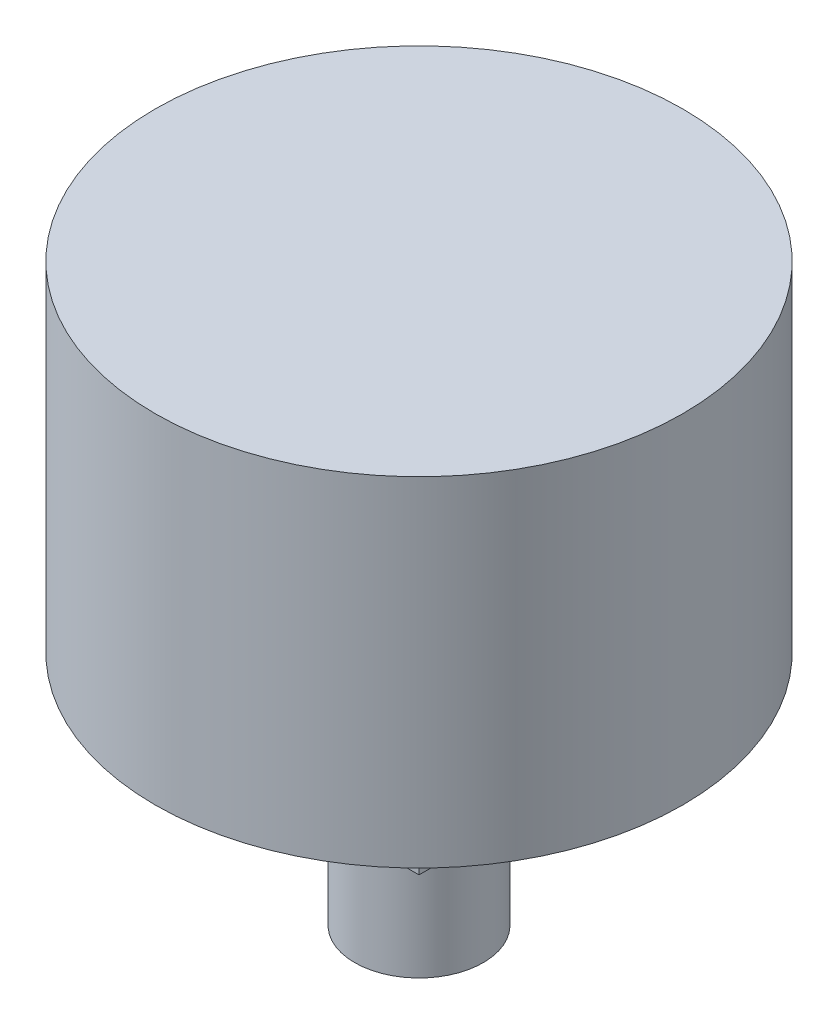
ISO-10303-21;
HEADER;
FILE_DESCRIPTION(('STEP AP214'),'2;1');
FILE_NAME('part.step','',(''),(''),'','','');
FILE_SCHEMA(('AUTOMOTIVE_DESIGN { 1 0 10303 214 1 1 1 1 }'));
ENDSEC;
DATA;
#1=APPLICATION_CONTEXT('core data for automotive mechanical design processes');
#2=APPLICATION_PROTOCOL_DEFINITION('international standard','automotive_design',2000,#1);
#3=PRODUCT_CONTEXT('',#1,'mechanical');
#4=PRODUCT('Part','Part','',(#3));
#5=PRODUCT_RELATED_PRODUCT_CATEGORY('part','',(#4));
#6=PRODUCT_DEFINITION_FORMATION('','',#4);
#7=PRODUCT_DEFINITION_CONTEXT('part definition',#1,'design');
#8=PRODUCT_DEFINITION('design','',#6,#7);
#9=PRODUCT_DEFINITION_SHAPE('','',#8);
#10=(LENGTH_UNIT() NAMED_UNIT(*) SI_UNIT(.MILLI.,.METRE.));
#11=(NAMED_UNIT(*) PLANE_ANGLE_UNIT() SI_UNIT($,.RADIAN.));
#12=(NAMED_UNIT(*) SI_UNIT($,.STERADIAN.) SOLID_ANGLE_UNIT());
#13=UNCERTAINTY_MEASURE_WITH_UNIT(LENGTH_MEASURE(1.E-05),#10,'distance_accuracy_value','');
#14=(GEOMETRIC_REPRESENTATION_CONTEXT(3) GLOBAL_UNCERTAINTY_ASSIGNED_CONTEXT((#13)) GLOBAL_UNIT_ASSIGNED_CONTEXT((#10,
#11,#12)) REPRESENTATION_CONTEXT('',''));
#15=CARTESIAN_POINT('',(0.,0.,0.));
#16=DIRECTION('',(0.,0.,1.));
#17=DIRECTION('',(1.,0.,0.));
#18=AXIS2_PLACEMENT_3D('',#15,#16,#17);
#19=CARTESIAN_POINT('',(7.0231,-7.7978,7.0231));
#20=DIRECTION('',(0.,1.,0.));
#21=DIRECTION('',(0.,0.,1.));
#22=AXIS2_PLACEMENT_3D('',#19,#20,#21);
#23=PLANE('',#22);
#24=DIRECTION('',(0.,0.,1.));
#25=VECTOR('',#24,1.);
#26=CARTESIAN_POINT('',(7.0231,-7.7978,-7.0231));
#27=LINE('',#26,#25);
#28=CARTESIAN_POINT('',(7.0231,-7.7978,-7.0231));
#29=VERTEX_POINT('',#28);
#30=CARTESIAN_POINT('',(7.0231,-7.7978,7.0231));
#31=VERTEX_POINT('',#30);
#32=EDGE_CURVE('E83',#29,#31,#27,.T.);
#33=ORIENTED_EDGE('',*,*,#32,.T.);
#34=DIRECTION('',(-1.,0.,0.));
#35=VECTOR('',#34,1.);
#36=CARTESIAN_POINT('',(-7.0231,-7.7978,7.0231));
#37=LINE('',#36,#35);
#38=CARTESIAN_POINT('',(-7.0231,-7.7978,7.0231));
#39=VERTEX_POINT('',#38);
#40=EDGE_CURVE('E72',#31,#39,#37,.T.);
#41=ORIENTED_EDGE('',*,*,#40,.T.);
#42=DIRECTION('',(0.,0.,-1.));
#43=VECTOR('',#42,1.);
#44=CARTESIAN_POINT('',(-7.0231,-7.7978,-7.0231));
#45=LINE('',#44,#43);
#46=CARTESIAN_POINT('',(-7.0231,-7.7978,-7.0231));
#47=VERTEX_POINT('',#46);
#48=EDGE_CURVE('E82',#39,#47,#45,.T.);
#49=ORIENTED_EDGE('',*,*,#48,.T.);
#50=DIRECTION('',(1.,0.,0.));
#51=VECTOR('',#50,1.);
#52=CARTESIAN_POINT('',(-7.0231,-7.7978,-7.0231));
#53=LINE('',#52,#51);
#54=EDGE_CURVE('E88',#47,#29,#53,.T.);
#55=ORIENTED_EDGE('',*,*,#54,.T.);
#56=EDGE_LOOP('',(#33,#41,#49,#55));
#57=FACE_BOUND('',#56,.T.);
#58=CARTESIAN_POINT('',(0.,-7.7978,0.));
#59=DIRECTION('',(0.,1.,0.));
#60=DIRECTION('',(0.,0.,1.));
#61=AXIS2_PLACEMENT_3D('',#58,#59,#60);
#62=CIRCLE('',#61,4.953);
#63=CARTESIAN_POINT('',(0.,-7.7978,4.953));
#64=VERTEX_POINT('',#63);
#65=EDGE_CURVE('E12',#64,#64,#62,.F.);
#66=ORIENTED_EDGE('',*,*,#65,.F.);
#67=EDGE_LOOP('',(#66));
#68=FACE_BOUND('',#67,.T.);
#69=ADVANCED_FACE('F34',(#57,#68),#23,.F.);
#70=CARTESIAN_POINT('',(0.,0.,0.));
#71=DIRECTION('',(0.,1.,0.));
#72=DIRECTION('',(0.,0.,1.));
#73=AXIS2_PLACEMENT_3D('',#70,#71,#72);
#74=PLANE('',#73);
#75=CARTESIAN_POINT('',(0.,0.,0.));
#76=DIRECTION('',(0.,1.,0.));
#77=DIRECTION('',(0.,0.,1.));
#78=AXIS2_PLACEMENT_3D('',#75,#76,#77);
#79=CIRCLE('',#78,20.32);
#80=CARTESIAN_POINT('',(0.,0.,20.32));
#81=VERTEX_POINT('',#80);
#82=EDGE_CURVE('E96',#81,#81,#79,.T.);
#83=ORIENTED_EDGE('',*,*,#82,.F.);
#84=EDGE_LOOP('',(#83));
#85=FACE_BOUND('',#84,.T.);
#86=DIRECTION('',(0.,0.,1.));
#87=VECTOR('',#86,1.);
#88=CARTESIAN_POINT('',(7.0231,0.,-7.0231));
#89=LINE('',#88,#87);
#90=CARTESIAN_POINT('',(7.0231,0.,-7.0231));
#91=VERTEX_POINT('',#90);
#92=CARTESIAN_POINT('',(7.0231,0.,7.0231));
#93=VERTEX_POINT('',#92);
#94=EDGE_CURVE('E95',#91,#93,#89,.T.);
#95=ORIENTED_EDGE('',*,*,#94,.F.);
#96=DIRECTION('',(1.,0.,0.));
#97=VECTOR('',#96,1.);
#98=CARTESIAN_POINT('',(-7.0231,0.,-7.0231));
#99=LINE('',#98,#97);
#100=CARTESIAN_POINT('',(-7.0231,0.,-7.0231));
#101=VERTEX_POINT('',#100);
#102=EDGE_CURVE('E92',#101,#91,#99,.T.);
#103=ORIENTED_EDGE('',*,*,#102,.F.);
#104=DIRECTION('',(0.,0.,-1.));
#105=VECTOR('',#104,1.);
#106=CARTESIAN_POINT('',(-7.0231,0.,-7.0231));
#107=LINE('',#106,#105);
#108=CARTESIAN_POINT('',(-7.0231,0.,7.0231));
#109=VERTEX_POINT('',#108);
#110=EDGE_CURVE('E54',#109,#101,#107,.T.);
#111=ORIENTED_EDGE('',*,*,#110,.F.);
#112=DIRECTION('',(-1.,0.,0.));
#113=VECTOR('',#112,1.);
#114=CARTESIAN_POINT('',(-7.0231,0.,7.0231));
#115=LINE('',#114,#113);
#116=EDGE_CURVE('E49',#93,#109,#115,.T.);
#117=ORIENTED_EDGE('',*,*,#116,.F.);
#118=EDGE_LOOP('',(#95,#103,#111,#117));
#119=FACE_BOUND('',#118,.T.);
#120=ADVANCED_FACE('F110',(#85,#119),#74,.F.);
#121=CARTESIAN_POINT('',(0.,26.0985,0.));
#122=DIRECTION('',(0.,-1.,0.));
#123=DIRECTION('',(0.,0.,-1.));
#124=AXIS2_PLACEMENT_3D('',#121,#122,#123);
#125=CYLINDRICAL_SURFACE('',#124,20.32);
#126=CARTESIAN_POINT('',(0.,26.0985,0.));
#127=DIRECTION('',(0.,1.,0.));
#128=DIRECTION('',(0.,0.,1.));
#129=AXIS2_PLACEMENT_3D('',#126,#127,#128);
#130=CIRCLE('',#129,20.32);
#131=CARTESIAN_POINT('',(0.,26.0985,20.32));
#132=VERTEX_POINT('',#131);
#133=EDGE_CURVE('E42',#132,#132,#130,.T.);
#134=ORIENTED_EDGE('',*,*,#133,.F.);
#135=EDGE_LOOP('',(#134));
#136=FACE_BOUND('',#135,.T.);
#137=ORIENTED_EDGE('',*,*,#82,.T.);
#138=EDGE_LOOP('',(#137));
#139=FACE_BOUND('',#138,.T.);
#140=ADVANCED_FACE('F36',(#136,#139),#125,.T.);
#141=CARTESIAN_POINT('',(0.,26.0985,0.));
#142=DIRECTION('',(0.,1.,0.));
#143=DIRECTION('',(0.,0.,1.));
#144=AXIS2_PLACEMENT_3D('',#141,#142,#143);
#145=PLANE('',#144);
#146=ORIENTED_EDGE('',*,*,#133,.T.);
#147=EDGE_LOOP('',(#146));
#148=FACE_BOUND('',#147,.T.);
#149=ADVANCED_FACE('F106',(#148),#145,.T.);
#150=CARTESIAN_POINT('',(7.0231,-7.7978,-7.0231));
#151=DIRECTION('',(-1.,0.,0.));
#152=DIRECTION('',(0.,0.,1.));
#153=AXIS2_PLACEMENT_3D('',#150,#151,#152);
#154=PLANE('',#153);
#155=ORIENTED_EDGE('',*,*,#94,.T.);
#156=DIRECTION('',(0.,1.,0.));
#157=VECTOR('',#156,1.);
#158=CARTESIAN_POINT('',(7.0231,-7.7978,7.0231));
#159=LINE('',#158,#157);
#160=EDGE_CURVE('E76',#31,#93,#159,.T.);
#161=ORIENTED_EDGE('',*,*,#160,.F.);
#162=ORIENTED_EDGE('',*,*,#32,.F.);
#163=DIRECTION('',(0.,1.,0.));
#164=VECTOR('',#163,1.);
#165=CARTESIAN_POINT('',(7.0231,-7.7978,-7.0231));
#166=LINE('',#165,#164);
#167=EDGE_CURVE('E120',#29,#91,#166,.T.);
#168=ORIENTED_EDGE('',*,*,#167,.T.);
#169=EDGE_LOOP('',(#155,#161,#162,#168));
#170=FACE_BOUND('',#169,.T.);
#171=ADVANCED_FACE('F94',(#170),#154,.F.);
#172=CARTESIAN_POINT('',(-7.0231,-7.7978,7.0231));
#173=DIRECTION('',(0.,0.,-1.));
#174=DIRECTION('',(-1.,0.,0.));
#175=AXIS2_PLACEMENT_3D('',#172,#173,#174);
#176=PLANE('',#175);
#177=ORIENTED_EDGE('',*,*,#116,.T.);
#178=DIRECTION('',(0.,1.,0.));
#179=VECTOR('',#178,1.);
#180=CARTESIAN_POINT('',(-7.0231,-7.7978,7.0231));
#181=LINE('',#180,#179);
#182=EDGE_CURVE('E79',#39,#109,#181,.T.);
#183=ORIENTED_EDGE('',*,*,#182,.F.);
#184=ORIENTED_EDGE('',*,*,#40,.F.);
#185=ORIENTED_EDGE('',*,*,#160,.T.);
#186=EDGE_LOOP('',(#177,#183,#184,#185));
#187=FACE_BOUND('',#186,.T.);
#188=ADVANCED_FACE('F74',(#187),#176,.F.);
#189=CARTESIAN_POINT('',(-7.0231,-7.7978,-7.0231));
#190=DIRECTION('',(1.,0.,0.));
#191=DIRECTION('',(0.,0.,-1.));
#192=AXIS2_PLACEMENT_3D('',#189,#190,#191);
#193=PLANE('',#192);
#194=ORIENTED_EDGE('',*,*,#110,.T.);
#195=DIRECTION('',(0.,1.,0.));
#196=VECTOR('',#195,1.);
#197=CARTESIAN_POINT('',(-7.0231,-7.7978,-7.0231));
#198=LINE('',#197,#196);
#199=EDGE_CURVE('E99',#47,#101,#198,.T.);
#200=ORIENTED_EDGE('',*,*,#199,.F.);
#201=ORIENTED_EDGE('',*,*,#48,.F.);
#202=ORIENTED_EDGE('',*,*,#182,.T.);
#203=EDGE_LOOP('',(#194,#200,#201,#202));
#204=FACE_BOUND('',#203,.T.);
#205=ADVANCED_FACE('F149',(#204),#193,.F.);
#206=CARTESIAN_POINT('',(-7.0231,-7.7978,-7.0231));
#207=DIRECTION('',(0.,0.,1.));
#208=DIRECTION('',(1.,0.,0.));
#209=AXIS2_PLACEMENT_3D('',#206,#207,#208);
#210=PLANE('',#209);
#211=ORIENTED_EDGE('',*,*,#102,.T.);
#212=ORIENTED_EDGE('',*,*,#167,.F.);
#213=ORIENTED_EDGE('',*,*,#54,.F.);
#214=ORIENTED_EDGE('',*,*,#199,.T.);
#215=EDGE_LOOP('',(#211,#212,#213,#214));
#216=FACE_BOUND('',#215,.T.);
#217=ADVANCED_FACE('F119',(#216),#210,.F.);
#218=CARTESIAN_POINT('',(0.,-50.4073995488679,0.));
#219=DIRECTION('',(0.,1.,0.));
#220=DIRECTION('',(0.,0.,1.));
#221=AXIS2_PLACEMENT_3D('',#218,#219,#220);
#222=CYLINDRICAL_SURFACE('',#221,4.953);
#223=CARTESIAN_POINT('',(0.,-18.1991,0.));
#224=DIRECTION('',(0.,1.,0.));
#225=DIRECTION('',(0.,0.,1.));
#226=AXIS2_PLACEMENT_3D('',#223,#224,#225);
#227=CIRCLE('',#226,4.953);
#228=CARTESIAN_POINT('',(0.,-18.1991,4.953));
#229=VERTEX_POINT('',#228);
#230=EDGE_CURVE('E115',#229,#229,#227,.T.);
#231=ORIENTED_EDGE('',*,*,#230,.T.);
#232=EDGE_LOOP('',(#231));
#233=FACE_BOUND('',#232,.T.);
#234=ORIENTED_EDGE('',*,*,#65,.T.);
#235=EDGE_LOOP('',(#234));
#236=FACE_BOUND('',#235,.T.);
#237=ADVANCED_FACE('F132',(#233,#236),#222,.T.);
#238=CARTESIAN_POINT('',(0.,-18.1991,0.));
#239=DIRECTION('',(0.,1.,0.));
#240=DIRECTION('',(0.,0.,1.));
#241=AXIS2_PLACEMENT_3D('',#238,#239,#240);
#242=PLANE('',#241);
#243=ORIENTED_EDGE('',*,*,#230,.F.);
#244=EDGE_LOOP('',(#243));
#245=FACE_BOUND('',#244,.T.);
#246=ADVANCED_FACE('F135',(#245),#242,.F.);
#247=CLOSED_SHELL('',(#69,#120,#140,#149,#171,#188,#205,#217,#237,#246));
#248=MANIFOLD_SOLID_BREP('B2',#247);
#249=ADVANCED_BREP_SHAPE_REPRESENTATION('',(#18,#248),#14);
#250=SHAPE_DEFINITION_REPRESENTATION(#9,#249);
ENDSEC;
END-ISO-10303-21;
